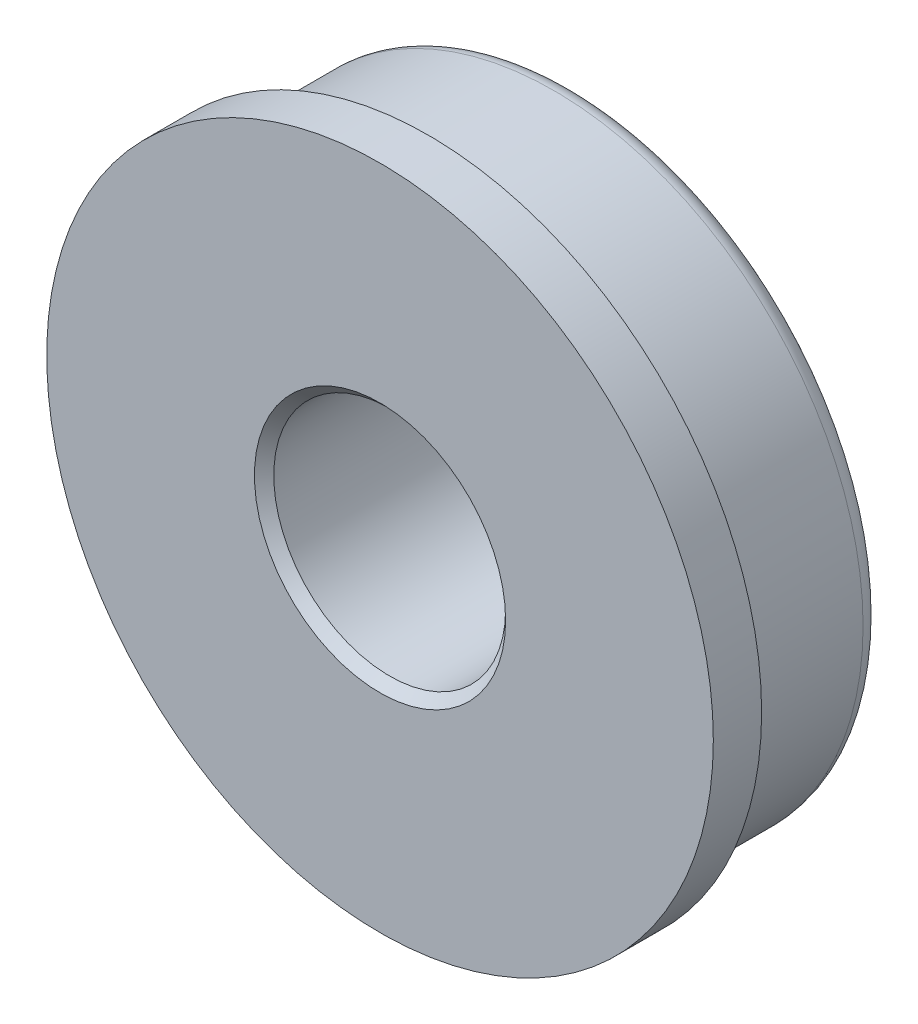
ISO-10303-21;
HEADER;
FILE_DESCRIPTION(('STEP AP214'),'2;1');
FILE_NAME('part.step','',(''),(''),'','','');
FILE_SCHEMA(('AUTOMOTIVE_DESIGN { 1 0 10303 214 1 1 1 1 }'));
ENDSEC;
DATA;
#1=APPLICATION_CONTEXT('core data for automotive mechanical design processes');
#2=APPLICATION_PROTOCOL_DEFINITION('international standard','automotive_design',2000,#1);
#3=PRODUCT_CONTEXT('',#1,'mechanical');
#4=PRODUCT('Part','Part','',(#3));
#5=PRODUCT_RELATED_PRODUCT_CATEGORY('part','',(#4));
#6=PRODUCT_DEFINITION_FORMATION('','',#4);
#7=PRODUCT_DEFINITION_CONTEXT('part definition',#1,'design');
#8=PRODUCT_DEFINITION('design','',#6,#7);
#9=PRODUCT_DEFINITION_SHAPE('','',#8);
#10=(LENGTH_UNIT() NAMED_UNIT(*) SI_UNIT(.MILLI.,.METRE.));
#11=(NAMED_UNIT(*) PLANE_ANGLE_UNIT() SI_UNIT($,.RADIAN.));
#12=(NAMED_UNIT(*) SI_UNIT($,.STERADIAN.) SOLID_ANGLE_UNIT());
#13=UNCERTAINTY_MEASURE_WITH_UNIT(LENGTH_MEASURE(1.E-05),#10,'distance_accuracy_value','');
#14=(GEOMETRIC_REPRESENTATION_CONTEXT(3) GLOBAL_UNCERTAINTY_ASSIGNED_CONTEXT((#13)) GLOBAL_UNIT_ASSIGNED_CONTEXT((#10,
#11,#12)) REPRESENTATION_CONTEXT('',''));
#15=CARTESIAN_POINT('',(0.,0.,0.));
#16=DIRECTION('',(0.,0.,1.));
#17=DIRECTION('',(1.,0.,0.));
#18=AXIS2_PLACEMENT_3D('',#15,#16,#17);
#19=CARTESIAN_POINT('',(0.,0.,5.));
#20=DIRECTION('',(0.,0.,-1.));
#21=DIRECTION('',(-1.,0.,0.));
#22=AXIS2_PLACEMENT_3D('',#19,#20,#21);
#23=CYLINDRICAL_SURFACE('',#22,16.);
#24=CARTESIAN_POINT('',(0.,0.,-4.));
#25=DIRECTION('',(0.,0.,1.));
#26=DIRECTION('',(1.,0.,0.));
#27=AXIS2_PLACEMENT_3D('',#24,#25,#26);
#28=CIRCLE('',#27,16.);
#29=CARTESIAN_POINT('',(16.,0.,-4.));
#30=VERTEX_POINT('',#29);
#31=EDGE_CURVE('E42',#30,#30,#28,.T.);
#32=ORIENTED_EDGE('',*,*,#31,.T.);
#33=EDGE_LOOP('',(#32));
#34=FACE_BOUND('',#33,.T.);
#35=CARTESIAN_POINT('',(0.,0.,2.5));
#36=DIRECTION('',(0.,0.,1.));
#37=DIRECTION('',(1.,0.,0.));
#38=AXIS2_PLACEMENT_3D('',#35,#36,#37);
#39=CIRCLE('',#38,16.);
#40=CARTESIAN_POINT('',(16.,0.,2.5));
#41=VERTEX_POINT('',#40);
#42=EDGE_CURVE('E61',#41,#41,#39,.T.);
#43=ORIENTED_EDGE('',*,*,#42,.F.);
#44=EDGE_LOOP('',(#43));
#45=FACE_BOUND('',#44,.T.);
#46=ADVANCED_FACE('F35',(#34,#45),#23,.T.);
#47=CARTESIAN_POINT('',(0.,0.,5.));
#48=DIRECTION('',(0.,0.,1.));
#49=DIRECTION('',(1.,0.,0.));
#50=AXIS2_PLACEMENT_3D('',#47,#48,#49);
#51=PLANE('',#50);
#52=CARTESIAN_POINT('',(0.,0.,5.));
#53=DIRECTION('',(0.,0.,1.));
#54=DIRECTION('',(1.,0.,0.));
#55=AXIS2_PLACEMENT_3D('',#52,#53,#54);
#56=CIRCLE('',#55,6.5);
#57=CARTESIAN_POINT('',(6.5,0.,5.));
#58=VERTEX_POINT('',#57);
#59=EDGE_CURVE('E46',#58,#58,#56,.F.);
#60=ORIENTED_EDGE('',*,*,#59,.T.);
#61=EDGE_LOOP('',(#60));
#62=FACE_BOUND('',#61,.T.);
#63=CARTESIAN_POINT('',(0.,0.,5.));
#64=DIRECTION('',(0.,0.,1.));
#65=DIRECTION('',(1.,0.,0.));
#66=AXIS2_PLACEMENT_3D('',#63,#64,#65);
#67=CIRCLE('',#66,17.25);
#68=CARTESIAN_POINT('',(17.25,0.,5.));
#69=VERTEX_POINT('',#68);
#70=EDGE_CURVE('E65',#69,#69,#67,.T.);
#71=ORIENTED_EDGE('',*,*,#70,.T.);
#72=EDGE_LOOP('',(#71));
#73=FACE_BOUND('',#72,.T.);
#74=ADVANCED_FACE('F89',(#62,#73),#51,.T.);
#75=CARTESIAN_POINT('',(0.,0.,-5.));
#76=DIRECTION('',(0.,0.,1.));
#77=DIRECTION('',(1.,0.,0.));
#78=AXIS2_PLACEMENT_3D('',#75,#76,#77);
#79=PLANE('',#78);
#80=CARTESIAN_POINT('',(0.,0.,-5.));
#81=DIRECTION('',(0.,0.,1.));
#82=DIRECTION('',(1.,0.,0.));
#83=AXIS2_PLACEMENT_3D('',#80,#81,#82);
#84=CIRCLE('',#83,15.);
#85=CARTESIAN_POINT('',(15.,0.,-5.));
#86=VERTEX_POINT('',#85);
#87=EDGE_CURVE('E10',#86,#86,#84,.F.);
#88=ORIENTED_EDGE('',*,*,#87,.T.);
#89=EDGE_LOOP('',(#88));
#90=FACE_BOUND('',#89,.T.);
#91=CARTESIAN_POINT('',(0.,0.,-5.));
#92=DIRECTION('',(0.,0.,1.));
#93=DIRECTION('',(1.,0.,0.));
#94=AXIS2_PLACEMENT_3D('',#91,#92,#93);
#95=CIRCLE('',#94,6.49999999999999);
#96=CARTESIAN_POINT('',(6.49999999999999,0.,-5.));
#97=VERTEX_POINT('',#96);
#98=EDGE_CURVE('E58',#97,#97,#95,.T.);
#99=ORIENTED_EDGE('',*,*,#98,.T.);
#100=EDGE_LOOP('',(#99));
#101=FACE_BOUND('',#100,.T.);
#102=ADVANCED_FACE('F94',(#90,#101),#79,.F.);
#103=CARTESIAN_POINT('',(0.,0.,5.));
#104=DIRECTION('',(0.,0.,-1.));
#105=DIRECTION('',(-1.,0.,0.));
#106=AXIS2_PLACEMENT_3D('',#103,#104,#105);
#107=CYLINDRICAL_SURFACE('',#106,6.);
#108=CARTESIAN_POINT('',(0.,0.,-4.50000000000001));
#109=DIRECTION('',(0.,0.,1.));
#110=DIRECTION('',(1.,0.,0.));
#111=AXIS2_PLACEMENT_3D('',#108,#109,#110);
#112=CIRCLE('',#111,6.);
#113=CARTESIAN_POINT('',(6.,0.,-4.50000000000001));
#114=VERTEX_POINT('',#113);
#115=EDGE_CURVE('E50',#114,#114,#112,.F.);
#116=ORIENTED_EDGE('',*,*,#115,.T.);
#117=EDGE_LOOP('',(#116));
#118=FACE_BOUND('',#117,.T.);
#119=CARTESIAN_POINT('',(0.,0.,4.50000000000001));
#120=DIRECTION('',(0.,0.,1.));
#121=DIRECTION('',(1.,0.,0.));
#122=AXIS2_PLACEMENT_3D('',#119,#120,#121);
#123=CIRCLE('',#122,6.);
#124=CARTESIAN_POINT('',(6.,0.,4.50000000000001));
#125=VERTEX_POINT('',#124);
#126=EDGE_CURVE('E55',#125,#125,#123,.T.);
#127=ORIENTED_EDGE('',*,*,#126,.T.);
#128=EDGE_LOOP('',(#127));
#129=FACE_BOUND('',#128,.T.);
#130=ADVANCED_FACE('F86',(#118,#129),#107,.F.);
#131=CARTESIAN_POINT('',(0.,0.,2.5));
#132=DIRECTION('',(0.,0.,1.));
#133=DIRECTION('',(1.,0.,0.));
#134=AXIS2_PLACEMENT_3D('',#131,#132,#133);
#135=CYLINDRICAL_SURFACE('',#134,17.25);
#136=CARTESIAN_POINT('',(0.,0.,2.5));
#137=DIRECTION('',(0.,0.,1.));
#138=DIRECTION('',(1.,0.,0.));
#139=AXIS2_PLACEMENT_3D('',#136,#137,#138);
#140=CIRCLE('',#139,17.25);
#141=CARTESIAN_POINT('',(17.25,0.,2.5));
#142=VERTEX_POINT('',#141);
#143=EDGE_CURVE('E64',#142,#142,#140,.T.);
#144=ORIENTED_EDGE('',*,*,#143,.T.);
#145=EDGE_LOOP('',(#144));
#146=FACE_BOUND('',#145,.T.);
#147=ORIENTED_EDGE('',*,*,#70,.F.);
#148=EDGE_LOOP('',(#147));
#149=FACE_BOUND('',#148,.T.);
#150=ADVANCED_FACE('F71',(#146,#149),#135,.T.);
#151=CARTESIAN_POINT('',(0.,0.,2.5));
#152=DIRECTION('',(0.,0.,1.));
#153=DIRECTION('',(1.,0.,0.));
#154=AXIS2_PLACEMENT_3D('',#151,#152,#153);
#155=PLANE('',#154);
#156=ORIENTED_EDGE('',*,*,#42,.T.);
#157=EDGE_LOOP('',(#156));
#158=FACE_BOUND('',#157,.T.);
#159=ORIENTED_EDGE('',*,*,#143,.F.);
#160=EDGE_LOOP('',(#159));
#161=FACE_BOUND('',#160,.T.);
#162=ADVANCED_FACE('F74',(#158,#161),#155,.F.);
#163=CARTESIAN_POINT('',(0.,0.,-5.));
#164=DIRECTION('',(0.,0.,-1.));
#165=DIRECTION('',(-1.,0.,0.));
#166=AXIS2_PLACEMENT_3D('',#163,#164,#165);
#167=CONICAL_SURFACE('',#166,6.49999999999999,0.785398163397446);
#168=ORIENTED_EDGE('',*,*,#115,.F.);
#169=EDGE_LOOP('',(#168));
#170=FACE_BOUND('',#169,.T.);
#171=ORIENTED_EDGE('',*,*,#98,.F.);
#172=EDGE_LOOP('',(#171));
#173=FACE_BOUND('',#172,.T.);
#174=ADVANCED_FACE('F76',(#170,#173),#167,.F.);
#175=CARTESIAN_POINT('',(0.,0.,4.50000000000001));
#176=DIRECTION('',(0.,0.,1.));
#177=DIRECTION('',(1.,0.,0.));
#178=AXIS2_PLACEMENT_3D('',#175,#176,#177);
#179=CONICAL_SURFACE('',#178,6.,0.785398163397455);
#180=ORIENTED_EDGE('',*,*,#59,.F.);
#181=EDGE_LOOP('',(#180));
#182=FACE_BOUND('',#181,.T.);
#183=ORIENTED_EDGE('',*,*,#126,.F.);
#184=EDGE_LOOP('',(#183));
#185=FACE_BOUND('',#184,.T.);
#186=ADVANCED_FACE('F83',(#182,#185),#179,.F.);
#187=CARTESIAN_POINT('',(0.,0.,-4.));
#188=DIRECTION('',(0.,0.,1.));
#189=DIRECTION('',(1.,0.,0.));
#190=AXIS2_PLACEMENT_3D('',#187,#188,#189);
#191=TOROIDAL_SURFACE('',#190,15.,1.);
#192=ORIENTED_EDGE('',*,*,#87,.F.);
#193=EDGE_LOOP('',(#192));
#194=FACE_BOUND('',#193,.T.);
#195=ORIENTED_EDGE('',*,*,#31,.F.);
#196=EDGE_LOOP('',(#195));
#197=FACE_BOUND('',#196,.T.);
#198=ADVANCED_FACE('F37',(#194,#197),#191,.T.);
#199=CLOSED_SHELL('',(#46,#74,#102,#130,#150,#162,#174,#186,#198));
#200=MANIFOLD_SOLID_BREP('B2',#199);
#201=ADVANCED_BREP_SHAPE_REPRESENTATION('',(#18,#200),#14);
#202=SHAPE_DEFINITION_REPRESENTATION(#9,#201);
ENDSEC;
END-ISO-10303-21;
